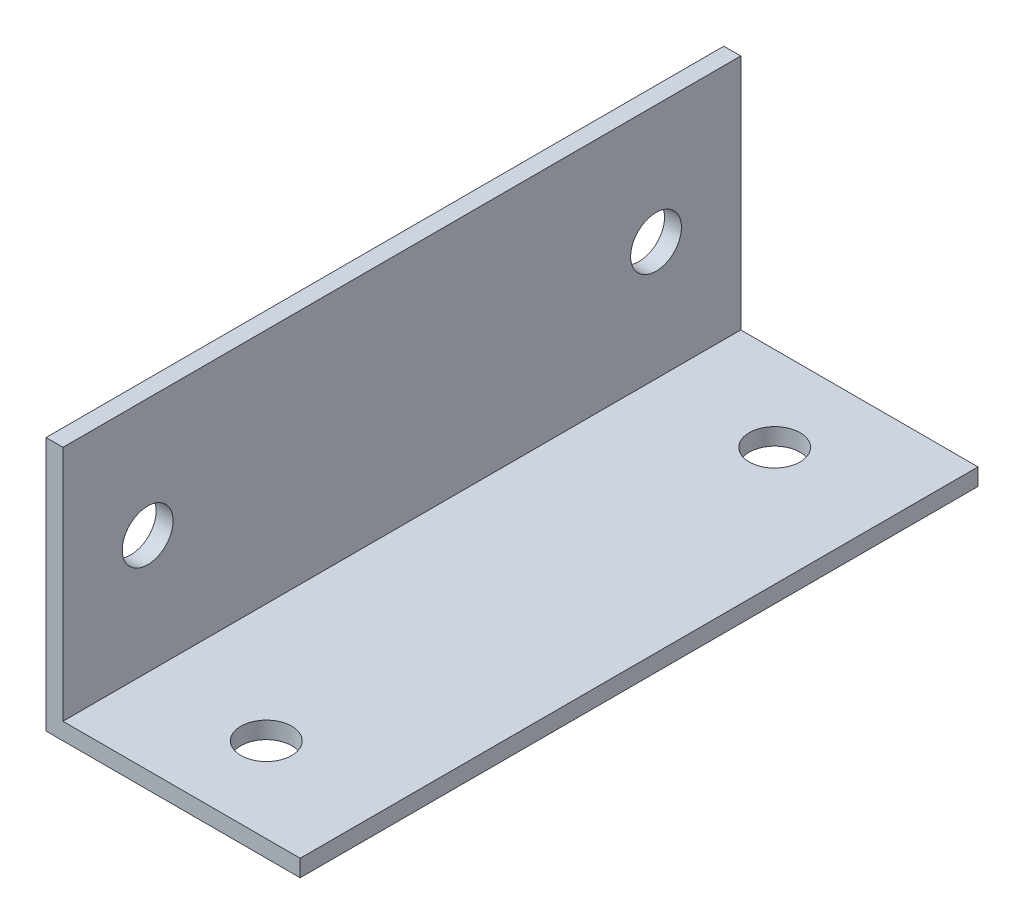
ISO-10303-21;
HEADER;
FILE_DESCRIPTION(('STEP AP214'),'2;1');
FILE_NAME('part.step','',(''),(''),'','','');
FILE_SCHEMA(('AUTOMOTIVE_DESIGN { 1 0 10303 214 1 1 1 1 }'));
ENDSEC;
DATA;
#1=APPLICATION_CONTEXT('core data for automotive mechanical design processes');
#2=APPLICATION_PROTOCOL_DEFINITION('international standard','automotive_design',2000,#1);
#3=PRODUCT_CONTEXT('',#1,'mechanical');
#4=PRODUCT('Part','Part','',(#3));
#5=PRODUCT_RELATED_PRODUCT_CATEGORY('part','',(#4));
#6=PRODUCT_DEFINITION_FORMATION('','',#4);
#7=PRODUCT_DEFINITION_CONTEXT('part definition',#1,'design');
#8=PRODUCT_DEFINITION('design','',#6,#7);
#9=PRODUCT_DEFINITION_SHAPE('','',#8);
#10=(LENGTH_UNIT() NAMED_UNIT(*) SI_UNIT(.MILLI.,.METRE.));
#11=(NAMED_UNIT(*) PLANE_ANGLE_UNIT() SI_UNIT($,.RADIAN.));
#12=(NAMED_UNIT(*) SI_UNIT($,.STERADIAN.) SOLID_ANGLE_UNIT());
#13=UNCERTAINTY_MEASURE_WITH_UNIT(LENGTH_MEASURE(1.E-05),#10,'distance_accuracy_value','');
#14=(GEOMETRIC_REPRESENTATION_CONTEXT(3) GLOBAL_UNCERTAINTY_ASSIGNED_CONTEXT((#13)) GLOBAL_UNIT_ASSIGNED_CONTEXT((#10,
#11,#12)) REPRESENTATION_CONTEXT('',''));
#15=CARTESIAN_POINT('',(0.,0.,0.));
#16=DIRECTION('',(0.,0.,1.));
#17=DIRECTION('',(1.,0.,0.));
#18=AXIS2_PLACEMENT_3D('',#15,#16,#17);
#19=CARTESIAN_POINT('',(14.,0.,40.));
#20=DIRECTION('',(0.,-1.,0.));
#21=DIRECTION('',(1.,0.,0.));
#22=AXIS2_PLACEMENT_3D('',#19,#20,#21);
#23=PLANE('',#22);
#24=CARTESIAN_POINT('',(7.,0.,5.));
#25=DIRECTION('',(0.,1.,0.));
#26=DIRECTION('',(-1.,0.,0.));
#27=AXIS2_PLACEMENT_3D('',#24,#25,#26);
#28=CIRCLE('',#27,1.5);
#29=CARTESIAN_POINT('',(5.5,0.,5.));
#30=VERTEX_POINT('',#29);
#31=EDGE_CURVE('E183',#30,#30,#28,.T.);
#32=ORIENTED_EDGE('',*,*,#31,.F.);
#33=EDGE_LOOP('',(#32));
#34=FACE_BOUND('',#33,.T.);
#35=CARTESIAN_POINT('',(7.,0.,35.));
#36=DIRECTION('',(0.,1.,0.));
#37=DIRECTION('',(1.,0.,0.));
#38=AXIS2_PLACEMENT_3D('',#35,#36,#37);
#39=CIRCLE('',#38,1.5);
#40=CARTESIAN_POINT('',(8.5,0.,35.));
#41=VERTEX_POINT('',#40);
#42=EDGE_CURVE('E186',#41,#41,#39,.T.);
#43=ORIENTED_EDGE('',*,*,#42,.F.);
#44=EDGE_LOOP('',(#43));
#45=FACE_BOUND('',#44,.T.);
#46=DIRECTION('',(-1.,0.,0.));
#47=VECTOR('',#46,1.);
#48=CARTESIAN_POINT('',(14.,0.,0.));
#49=LINE('',#48,#47);
#50=CARTESIAN_POINT('',(14.,0.,0.));
#51=VERTEX_POINT('',#50);
#52=CARTESIAN_POINT('',(0.,0.,0.));
#53=VERTEX_POINT('',#52);
#54=EDGE_CURVE('E128',#51,#53,#49,.T.);
#55=ORIENTED_EDGE('',*,*,#54,.T.);
#56=DIRECTION('',(0.,0.,-1.));
#57=VECTOR('',#56,1.);
#58=CARTESIAN_POINT('',(0.,0.,40.));
#59=LINE('',#58,#57);
#60=CARTESIAN_POINT('',(0.,0.,40.));
#61=VERTEX_POINT('',#60);
#62=EDGE_CURVE('E11',#61,#53,#59,.T.);
#63=ORIENTED_EDGE('',*,*,#62,.F.);
#64=DIRECTION('',(-1.,0.,0.));
#65=VECTOR('',#64,1.);
#66=CARTESIAN_POINT('',(14.,0.,40.));
#67=LINE('',#66,#65);
#68=CARTESIAN_POINT('',(14.,0.,40.));
#69=VERTEX_POINT('',#68);
#70=EDGE_CURVE('E145',#69,#61,#67,.T.);
#71=ORIENTED_EDGE('',*,*,#70,.F.);
#72=DIRECTION('',(0.,0.,-1.));
#73=VECTOR('',#72,1.);
#74=CARTESIAN_POINT('',(14.,0.,40.));
#75=LINE('',#74,#73);
#76=EDGE_CURVE('E124',#69,#51,#75,.T.);
#77=ORIENTED_EDGE('',*,*,#76,.T.);
#78=EDGE_LOOP('',(#55,#63,#71,#77));
#79=FACE_BOUND('',#78,.T.);
#80=ADVANCED_FACE('F39',(#34,#45,#79),#23,.F.);
#81=CARTESIAN_POINT('',(0.,0.,40.));
#82=DIRECTION('',(-1.,0.,0.));
#83=DIRECTION('',(0.,-1.,0.));
#84=AXIS2_PLACEMENT_3D('',#81,#82,#83);
#85=PLANE('',#84);
#86=CARTESIAN_POINT('',(0.,7.,5.));
#87=DIRECTION('',(-1.,0.,0.));
#88=DIRECTION('',(0.,-1.,0.));
#89=AXIS2_PLACEMENT_3D('',#86,#87,#88);
#90=CIRCLE('',#89,1.5);
#91=CARTESIAN_POINT('',(0.,5.5,5.));
#92=VERTEX_POINT('',#91);
#93=EDGE_CURVE('E197',#92,#92,#90,.T.);
#94=ORIENTED_EDGE('',*,*,#93,.T.);
#95=EDGE_LOOP('',(#94));
#96=FACE_BOUND('',#95,.T.);
#97=CARTESIAN_POINT('',(0.,7.,35.));
#98=DIRECTION('',(-1.,0.,0.));
#99=DIRECTION('',(0.,1.,0.));
#100=AXIS2_PLACEMENT_3D('',#97,#98,#99);
#101=CIRCLE('',#100,1.5);
#102=CARTESIAN_POINT('',(0.,8.5,35.));
#103=VERTEX_POINT('',#102);
#104=EDGE_CURVE('E211',#103,#103,#101,.T.);
#105=ORIENTED_EDGE('',*,*,#104,.T.);
#106=EDGE_LOOP('',(#105));
#107=FACE_BOUND('',#106,.T.);
#108=DIRECTION('',(0.,1.,0.));
#109=VECTOR('',#108,1.);
#110=CARTESIAN_POINT('',(0.,0.,0.));
#111=LINE('',#110,#109);
#112=CARTESIAN_POINT('',(0.,14.,0.));
#113=VERTEX_POINT('',#112);
#114=EDGE_CURVE('E132',#53,#113,#111,.T.);
#115=ORIENTED_EDGE('',*,*,#114,.T.);
#116=DIRECTION('',(0.,0.,-1.));
#117=VECTOR('',#116,1.);
#118=CARTESIAN_POINT('',(0.,14.,40.));
#119=LINE('',#118,#117);
#120=CARTESIAN_POINT('',(0.,14.,40.));
#121=VERTEX_POINT('',#120);
#122=EDGE_CURVE('E48',#121,#113,#119,.T.);
#123=ORIENTED_EDGE('',*,*,#122,.F.);
#124=DIRECTION('',(0.,1.,0.));
#125=VECTOR('',#124,1.);
#126=CARTESIAN_POINT('',(0.,0.,40.));
#127=LINE('',#126,#125);
#128=EDGE_CURVE('E93',#61,#121,#127,.T.);
#129=ORIENTED_EDGE('',*,*,#128,.F.);
#130=ORIENTED_EDGE('',*,*,#62,.T.);
#131=EDGE_LOOP('',(#115,#123,#129,#130));
#132=FACE_BOUND('',#131,.T.);
#133=ADVANCED_FACE('F174',(#96,#107,#132),#85,.F.);
#134=CARTESIAN_POINT('',(0.,14.,40.));
#135=DIRECTION('',(0.,-1.,0.));
#136=DIRECTION('',(1.,0.,0.));
#137=AXIS2_PLACEMENT_3D('',#134,#135,#136);
#138=PLANE('',#137);
#139=DIRECTION('',(-1.,0.,0.));
#140=VECTOR('',#139,1.);
#141=CARTESIAN_POINT('',(0.,14.,0.));
#142=LINE('',#141,#140);
#143=CARTESIAN_POINT('',(-0.999999999999999,14.,0.));
#144=VERTEX_POINT('',#143);
#145=EDGE_CURVE('E136',#113,#144,#142,.T.);
#146=ORIENTED_EDGE('',*,*,#145,.T.);
#147=DIRECTION('',(0.,0.,-1.));
#148=VECTOR('',#147,1.);
#149=CARTESIAN_POINT('',(-0.999999999999999,14.,40.));
#150=LINE('',#149,#148);
#151=CARTESIAN_POINT('',(-0.999999999999999,14.,40.));
#152=VERTEX_POINT('',#151);
#153=EDGE_CURVE('E117',#152,#144,#150,.T.);
#154=ORIENTED_EDGE('',*,*,#153,.F.);
#155=DIRECTION('',(-1.,0.,0.));
#156=VECTOR('',#155,1.);
#157=CARTESIAN_POINT('',(0.,14.,40.));
#158=LINE('',#157,#156);
#159=EDGE_CURVE('E106',#121,#152,#158,.T.);
#160=ORIENTED_EDGE('',*,*,#159,.F.);
#161=ORIENTED_EDGE('',*,*,#122,.T.);
#162=EDGE_LOOP('',(#146,#154,#160,#161));
#163=FACE_BOUND('',#162,.T.);
#164=ADVANCED_FACE('F155',(#163),#138,.F.);
#165=CARTESIAN_POINT('',(-0.999999999999999,14.,40.));
#166=DIRECTION('',(1.,0.,0.));
#167=DIRECTION('',(0.,1.,0.));
#168=AXIS2_PLACEMENT_3D('',#165,#166,#167);
#169=PLANE('',#168);
#170=CARTESIAN_POINT('',(-1.,7.,5.));
#171=DIRECTION('',(-1.,0.,0.));
#172=DIRECTION('',(0.,-1.,0.));
#173=AXIS2_PLACEMENT_3D('',#170,#171,#172);
#174=CIRCLE('',#173,1.5);
#175=CARTESIAN_POINT('',(-1.,5.5,5.));
#176=VERTEX_POINT('',#175);
#177=EDGE_CURVE('E190',#176,#176,#174,.T.);
#178=ORIENTED_EDGE('',*,*,#177,.F.);
#179=EDGE_LOOP('',(#178));
#180=FACE_BOUND('',#179,.T.);
#181=CARTESIAN_POINT('',(-1.,7.,35.));
#182=DIRECTION('',(-1.,0.,0.));
#183=DIRECTION('',(0.,1.,0.));
#184=AXIS2_PLACEMENT_3D('',#181,#182,#183);
#185=CIRCLE('',#184,1.5);
#186=CARTESIAN_POINT('',(-1.,8.5,35.));
#187=VERTEX_POINT('',#186);
#188=EDGE_CURVE('E215',#187,#187,#185,.T.);
#189=ORIENTED_EDGE('',*,*,#188,.F.);
#190=EDGE_LOOP('',(#189));
#191=FACE_BOUND('',#190,.T.);
#192=DIRECTION('',(0.,-1.,0.));
#193=VECTOR('',#192,1.);
#194=CARTESIAN_POINT('',(-0.999999999999999,14.,0.));
#195=LINE('',#194,#193);
#196=CARTESIAN_POINT('',(-1.,-0.999999999999998,0.));
#197=VERTEX_POINT('',#196);
#198=EDGE_CURVE('E115',#144,#197,#195,.T.);
#199=ORIENTED_EDGE('',*,*,#198,.T.);
#200=DIRECTION('',(0.,0.,-1.));
#201=VECTOR('',#200,1.);
#202=CARTESIAN_POINT('',(-1.,-0.999999999999998,40.));
#203=LINE('',#202,#201);
#204=CARTESIAN_POINT('',(-1.,-0.999999999999998,40.));
#205=VERTEX_POINT('',#204);
#206=EDGE_CURVE('E112',#205,#197,#203,.T.);
#207=ORIENTED_EDGE('',*,*,#206,.F.);
#208=DIRECTION('',(0.,-1.,0.));
#209=VECTOR('',#208,1.);
#210=CARTESIAN_POINT('',(-0.999999999999999,14.,40.));
#211=LINE('',#210,#209);
#212=EDGE_CURVE('E100',#152,#205,#211,.T.);
#213=ORIENTED_EDGE('',*,*,#212,.F.);
#214=ORIENTED_EDGE('',*,*,#153,.T.);
#215=EDGE_LOOP('',(#199,#207,#213,#214));
#216=FACE_BOUND('',#215,.T.);
#217=ADVANCED_FACE('F113',(#180,#191,#216),#169,.F.);
#218=CARTESIAN_POINT('',(-1.,-0.999999999999998,40.));
#219=DIRECTION('',(0.,1.,0.));
#220=DIRECTION('',(0.,0.,1.));
#221=AXIS2_PLACEMENT_3D('',#218,#219,#220);
#222=PLANE('',#221);
#223=CARTESIAN_POINT('',(7.,-0.999999999999999,5.));
#224=DIRECTION('',(0.,1.,0.));
#225=DIRECTION('',(-1.,0.,0.));
#226=AXIS2_PLACEMENT_3D('',#223,#224,#225);
#227=CIRCLE('',#226,1.5);
#228=CARTESIAN_POINT('',(5.5,-0.999999999999999,5.));
#229=VERTEX_POINT('',#228);
#230=EDGE_CURVE('E133',#229,#229,#227,.T.);
#231=ORIENTED_EDGE('',*,*,#230,.T.);
#232=EDGE_LOOP('',(#231));
#233=FACE_BOUND('',#232,.T.);
#234=CARTESIAN_POINT('',(7.,-0.999999999999999,35.));
#235=DIRECTION('',(0.,1.,0.));
#236=DIRECTION('',(1.,0.,0.));
#237=AXIS2_PLACEMENT_3D('',#234,#235,#236);
#238=CIRCLE('',#237,1.5);
#239=CARTESIAN_POINT('',(8.5,-0.999999999999999,35.));
#240=VERTEX_POINT('',#239);
#241=EDGE_CURVE('E189',#240,#240,#238,.T.);
#242=ORIENTED_EDGE('',*,*,#241,.T.);
#243=EDGE_LOOP('',(#242));
#244=FACE_BOUND('',#243,.T.);
#245=DIRECTION('',(1.,0.,0.));
#246=VECTOR('',#245,1.);
#247=CARTESIAN_POINT('',(-1.,-0.999999999999998,0.));
#248=LINE('',#247,#246);
#249=CARTESIAN_POINT('',(14.,-0.999999999999998,0.));
#250=VERTEX_POINT('',#249);
#251=EDGE_CURVE('E79',#197,#250,#248,.T.);
#252=ORIENTED_EDGE('',*,*,#251,.T.);
#253=DIRECTION('',(0.,0.,-1.));
#254=VECTOR('',#253,1.);
#255=CARTESIAN_POINT('',(14.,-0.999999999999998,40.));
#256=LINE('',#255,#254);
#257=CARTESIAN_POINT('',(14.,-0.999999999999998,40.));
#258=VERTEX_POINT('',#257);
#259=EDGE_CURVE('E118',#258,#250,#256,.T.);
#260=ORIENTED_EDGE('',*,*,#259,.F.);
#261=DIRECTION('',(1.,0.,0.));
#262=VECTOR('',#261,1.);
#263=CARTESIAN_POINT('',(-1.,-0.999999999999998,40.));
#264=LINE('',#263,#262);
#265=EDGE_CURVE('E104',#205,#258,#264,.T.);
#266=ORIENTED_EDGE('',*,*,#265,.F.);
#267=ORIENTED_EDGE('',*,*,#206,.T.);
#268=EDGE_LOOP('',(#252,#260,#266,#267));
#269=FACE_BOUND('',#268,.T.);
#270=ADVANCED_FACE('F120',(#233,#244,#269),#222,.F.);
#271=CARTESIAN_POINT('',(14.,-0.999999999999998,40.));
#272=DIRECTION('',(-1.,0.,0.));
#273=DIRECTION('',(0.,0.,1.));
#274=AXIS2_PLACEMENT_3D('',#271,#272,#273);
#275=PLANE('',#274);
#276=DIRECTION('',(0.,1.,0.));
#277=VECTOR('',#276,1.);
#278=CARTESIAN_POINT('',(14.,-0.999999999999998,0.));
#279=LINE('',#278,#277);
#280=EDGE_CURVE('E85',#250,#51,#279,.T.);
#281=ORIENTED_EDGE('',*,*,#280,.T.);
#282=ORIENTED_EDGE('',*,*,#76,.F.);
#283=DIRECTION('',(0.,1.,0.));
#284=VECTOR('',#283,1.);
#285=CARTESIAN_POINT('',(14.,-0.999999999999998,40.));
#286=LINE('',#285,#284);
#287=EDGE_CURVE('E56',#258,#69,#286,.T.);
#288=ORIENTED_EDGE('',*,*,#287,.F.);
#289=ORIENTED_EDGE('',*,*,#259,.T.);
#290=EDGE_LOOP('',(#281,#282,#288,#289));
#291=FACE_BOUND('',#290,.T.);
#292=ADVANCED_FACE('F162',(#291),#275,.F.);
#293=CARTESIAN_POINT('',(0.,0.,40.));
#294=DIRECTION('',(0.,0.,-1.));
#295=DIRECTION('',(-1.,0.,0.));
#296=AXIS2_PLACEMENT_3D('',#293,#294,#295);
#297=PLANE('',#296);
#298=ORIENTED_EDGE('',*,*,#70,.T.);
#299=ORIENTED_EDGE('',*,*,#128,.T.);
#300=ORIENTED_EDGE('',*,*,#159,.T.);
#301=ORIENTED_EDGE('',*,*,#212,.T.);
#302=ORIENTED_EDGE('',*,*,#265,.T.);
#303=ORIENTED_EDGE('',*,*,#287,.T.);
#304=EDGE_LOOP('',(#298,#299,#300,#301,#302,#303));
#305=FACE_BOUND('',#304,.T.);
#306=ADVANCED_FACE('F102',(#305),#297,.F.);
#307=CARTESIAN_POINT('',(0.,0.,0.));
#308=DIRECTION('',(0.,0.,-1.));
#309=DIRECTION('',(-1.,0.,0.));
#310=AXIS2_PLACEMENT_3D('',#307,#308,#309);
#311=PLANE('',#310);
#312=ORIENTED_EDGE('',*,*,#54,.F.);
#313=ORIENTED_EDGE('',*,*,#280,.F.);
#314=ORIENTED_EDGE('',*,*,#251,.F.);
#315=ORIENTED_EDGE('',*,*,#198,.F.);
#316=ORIENTED_EDGE('',*,*,#145,.F.);
#317=ORIENTED_EDGE('',*,*,#114,.F.);
#318=EDGE_LOOP('',(#312,#313,#314,#315,#316,#317));
#319=FACE_BOUND('',#318,.T.);
#320=ADVANCED_FACE('F158',(#319),#311,.T.);
#321=CARTESIAN_POINT('',(7.,-0.999999999999999,35.));
#322=DIRECTION('',(0.,1.,0.));
#323=DIRECTION('',(-1.,0.,0.));
#324=AXIS2_PLACEMENT_3D('',#321,#322,#323);
#325=CYLINDRICAL_SURFACE('',#324,1.5);
#326=ORIENTED_EDGE('',*,*,#241,.F.);
#327=EDGE_LOOP('',(#326));
#328=FACE_BOUND('',#327,.T.);
#329=ORIENTED_EDGE('',*,*,#42,.T.);
#330=EDGE_LOOP('',(#329));
#331=FACE_BOUND('',#330,.T.);
#332=ADVANCED_FACE('F238',(#328,#331),#325,.F.);
#333=CARTESIAN_POINT('',(7.,-0.999999999999999,5.));
#334=DIRECTION('',(0.,1.,0.));
#335=DIRECTION('',(-1.,0.,0.));
#336=AXIS2_PLACEMENT_3D('',#333,#334,#335);
#337=CYLINDRICAL_SURFACE('',#336,1.5);
#338=ORIENTED_EDGE('',*,*,#230,.F.);
#339=EDGE_LOOP('',(#338));
#340=FACE_BOUND('',#339,.T.);
#341=ORIENTED_EDGE('',*,*,#31,.T.);
#342=EDGE_LOOP('',(#341));
#343=FACE_BOUND('',#342,.T.);
#344=ADVANCED_FACE('F232',(#340,#343),#337,.F.);
#345=CARTESIAN_POINT('',(-1.,7.,35.));
#346=DIRECTION('',(1.,0.,0.));
#347=DIRECTION('',(0.,1.,0.));
#348=AXIS2_PLACEMENT_3D('',#345,#346,#347);
#349=CYLINDRICAL_SURFACE('',#348,1.5);
#350=ORIENTED_EDGE('',*,*,#188,.T.);
#351=EDGE_LOOP('',(#350));
#352=FACE_BOUND('',#351,.T.);
#353=ORIENTED_EDGE('',*,*,#104,.F.);
#354=EDGE_LOOP('',(#353));
#355=FACE_BOUND('',#354,.T.);
#356=ADVANCED_FACE('F226',(#352,#355),#349,.F.);
#357=CARTESIAN_POINT('',(-1.,7.,5.));
#358=DIRECTION('',(1.,0.,0.));
#359=DIRECTION('',(0.,1.,0.));
#360=AXIS2_PLACEMENT_3D('',#357,#358,#359);
#361=CYLINDRICAL_SURFACE('',#360,1.5);
#362=ORIENTED_EDGE('',*,*,#177,.T.);
#363=EDGE_LOOP('',(#362));
#364=FACE_BOUND('',#363,.T.);
#365=ORIENTED_EDGE('',*,*,#93,.F.);
#366=EDGE_LOOP('',(#365));
#367=FACE_BOUND('',#366,.T.);
#368=ADVANCED_FACE('F224',(#364,#367),#361,.F.);
#369=CLOSED_SHELL('',(#80,#133,#164,#217,#270,#292,#306,#320,#332,#344,#356,#368));
#370=MANIFOLD_SOLID_BREP('B2',#369);
#371=ADVANCED_BREP_SHAPE_REPRESENTATION('',(#18,#370),#14);
#372=SHAPE_DEFINITION_REPRESENTATION(#9,#371);
ENDSEC;
END-ISO-10303-21;
